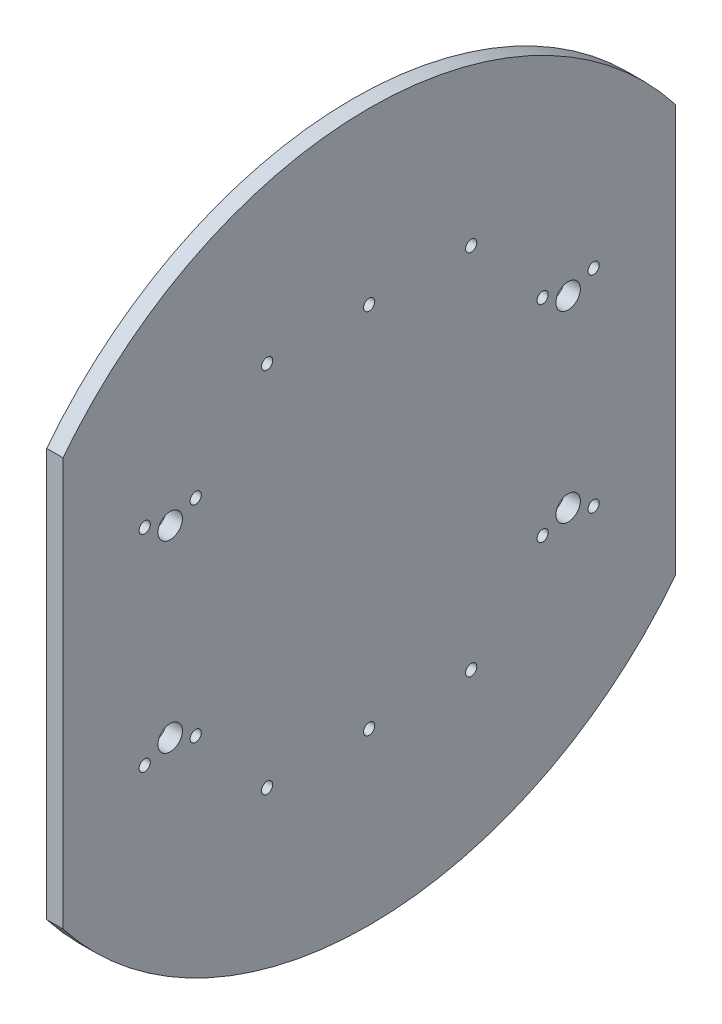
ISO-10303-21;
HEADER;
FILE_DESCRIPTION(('STEP AP214'),'2;1');
FILE_NAME('part.step','',(''),(''),'','','');
FILE_SCHEMA(('AUTOMOTIVE_DESIGN { 1 0 10303 214 1 1 1 1 }'));
ENDSEC;
DATA;
#1=APPLICATION_CONTEXT('core data for automotive mechanical design processes');
#2=APPLICATION_PROTOCOL_DEFINITION('international standard','automotive_design',2000,#1);
#3=PRODUCT_CONTEXT('',#1,'mechanical');
#4=PRODUCT('Part','Part','',(#3));
#5=PRODUCT_RELATED_PRODUCT_CATEGORY('part','',(#4));
#6=PRODUCT_DEFINITION_FORMATION('','',#4);
#7=PRODUCT_DEFINITION_CONTEXT('part definition',#1,'design');
#8=PRODUCT_DEFINITION('design','',#6,#7);
#9=PRODUCT_DEFINITION_SHAPE('','',#8);
#10=(LENGTH_UNIT() NAMED_UNIT(*) SI_UNIT(.MILLI.,.METRE.));
#11=(NAMED_UNIT(*) PLANE_ANGLE_UNIT() SI_UNIT($,.RADIAN.));
#12=(NAMED_UNIT(*) SI_UNIT($,.STERADIAN.) SOLID_ANGLE_UNIT());
#13=UNCERTAINTY_MEASURE_WITH_UNIT(LENGTH_MEASURE(1.E-05),#10,'distance_accuracy_value','');
#14=(GEOMETRIC_REPRESENTATION_CONTEXT(3) GLOBAL_UNCERTAINTY_ASSIGNED_CONTEXT((#13)) GLOBAL_UNIT_ASSIGNED_CONTEXT((#10,
#11,#12)) REPRESENTATION_CONTEXT('',''));
#15=CARTESIAN_POINT('',(0.,0.,0.));
#16=DIRECTION('',(0.,0.,1.));
#17=DIRECTION('',(1.,0.,0.));
#18=AXIS2_PLACEMENT_3D('',#15,#16,#17);
#19=CARTESIAN_POINT('',(8.,-16.619037896906,0.));
#20=DIRECTION('',(-1.,0.,0.));
#21=DIRECTION('',(0.,0.,1.));
#22=AXIS2_PLACEMENT_3D('',#19,#20,#21);
#23=CYLINDRICAL_SURFACE('',#22,190.);
#24=CARTESIAN_POINT('',(0.,-16.619037896906,0.));
#25=DIRECTION('',(1.,0.,0.));
#26=DIRECTION('',(0.,0.,-1.));
#27=AXIS2_PLACEMENT_3D('',#24,#25,#26);
#28=CIRCLE('',#27,190.);
#29=CARTESIAN_POINT('',(0.,100.,-150.));
#30=VERTEX_POINT('',#29);
#31=CARTESIAN_POINT('',(0.,100.,150.));
#32=VERTEX_POINT('',#31);
#33=EDGE_CURVE('E115',#30,#32,#28,.T.);
#34=ORIENTED_EDGE('',*,*,#33,.T.);
#35=DIRECTION('',(-1.,0.,0.));
#36=VECTOR('',#35,1.);
#37=CARTESIAN_POINT('',(8.,100.,150.));
#38=LINE('',#37,#36);
#39=CARTESIAN_POINT('',(8.,100.,150.));
#40=VERTEX_POINT('',#39);
#41=EDGE_CURVE('E11',#40,#32,#38,.T.);
#42=ORIENTED_EDGE('',*,*,#41,.F.);
#43=CARTESIAN_POINT('',(8.,-16.619037896906,0.));
#44=DIRECTION('',(1.,0.,0.));
#45=DIRECTION('',(0.,0.,-1.));
#46=AXIS2_PLACEMENT_3D('',#43,#44,#45);
#47=CIRCLE('',#46,190.);
#48=CARTESIAN_POINT('',(8.,100.,-150.));
#49=VERTEX_POINT('',#48);
#50=EDGE_CURVE('E98',#49,#40,#47,.T.);
#51=ORIENTED_EDGE('',*,*,#50,.F.);
#52=DIRECTION('',(-1.,0.,0.));
#53=VECTOR('',#52,1.);
#54=CARTESIAN_POINT('',(8.,100.,-150.));
#55=LINE('',#54,#53);
#56=EDGE_CURVE('E111',#49,#30,#55,.T.);
#57=ORIENTED_EDGE('',*,*,#56,.T.);
#58=EDGE_LOOP('',(#34,#42,#51,#57));
#59=FACE_BOUND('',#58,.T.);
#60=ADVANCED_FACE('F44',(#59),#23,.T.);
#61=CARTESIAN_POINT('',(8.,100.,150.));
#62=DIRECTION('',(0.,0.,-1.));
#63=DIRECTION('',(-1.,0.,0.));
#64=AXIS2_PLACEMENT_3D('',#61,#62,#63);
#65=PLANE('',#64);
#66=DIRECTION('',(0.,-1.,0.));
#67=VECTOR('',#66,1.);
#68=CARTESIAN_POINT('',(0.,100.,150.));
#69=LINE('',#68,#67);
#70=CARTESIAN_POINT('',(0.,-100.,150.));
#71=VERTEX_POINT('',#70);
#72=EDGE_CURVE('E103',#32,#71,#69,.T.);
#73=ORIENTED_EDGE('',*,*,#72,.T.);
#74=DIRECTION('',(-1.,0.,0.));
#75=VECTOR('',#74,1.);
#76=CARTESIAN_POINT('',(8.,-100.,150.));
#77=LINE('',#76,#75);
#78=CARTESIAN_POINT('',(8.,-100.,150.));
#79=VERTEX_POINT('',#78);
#80=EDGE_CURVE('E54',#79,#71,#77,.T.);
#81=ORIENTED_EDGE('',*,*,#80,.F.);
#82=DIRECTION('',(0.,-1.,0.));
#83=VECTOR('',#82,1.);
#84=CARTESIAN_POINT('',(8.,100.,150.));
#85=LINE('',#84,#83);
#86=EDGE_CURVE('E93',#40,#79,#85,.T.);
#87=ORIENTED_EDGE('',*,*,#86,.F.);
#88=ORIENTED_EDGE('',*,*,#41,.T.);
#89=EDGE_LOOP('',(#73,#81,#87,#88));
#90=FACE_BOUND('',#89,.T.);
#91=ADVANCED_FACE('F102',(#90),#65,.F.);
#92=CARTESIAN_POINT('',(8.,16.619037896906,0.));
#93=DIRECTION('',(-1.,0.,0.));
#94=DIRECTION('',(0.,0.,1.));
#95=AXIS2_PLACEMENT_3D('',#92,#93,#94);
#96=CYLINDRICAL_SURFACE('',#95,190.);
#97=CARTESIAN_POINT('',(0.,16.619037896906,0.));
#98=DIRECTION('',(1.,0.,0.));
#99=DIRECTION('',(0.,0.,1.));
#100=AXIS2_PLACEMENT_3D('',#97,#98,#99);
#101=CIRCLE('',#100,190.);
#102=CARTESIAN_POINT('',(0.,-99.9999999999999,-150.));
#103=VERTEX_POINT('',#102);
#104=EDGE_CURVE('E80',#71,#103,#101,.T.);
#105=ORIENTED_EDGE('',*,*,#104,.T.);
#106=DIRECTION('',(-1.,0.,0.));
#107=VECTOR('',#106,1.);
#108=CARTESIAN_POINT('',(8.,-99.9999999999999,-150.));
#109=LINE('',#108,#107);
#110=CARTESIAN_POINT('',(8.,-99.9999999999999,-150.));
#111=VERTEX_POINT('',#110);
#112=EDGE_CURVE('E105',#111,#103,#109,.T.);
#113=ORIENTED_EDGE('',*,*,#112,.F.);
#114=CARTESIAN_POINT('',(8.,16.619037896906,0.));
#115=DIRECTION('',(1.,0.,0.));
#116=DIRECTION('',(0.,0.,1.));
#117=AXIS2_PLACEMENT_3D('',#114,#115,#116);
#118=CIRCLE('',#117,190.);
#119=EDGE_CURVE('E96',#79,#111,#118,.T.);
#120=ORIENTED_EDGE('',*,*,#119,.F.);
#121=ORIENTED_EDGE('',*,*,#80,.T.);
#122=EDGE_LOOP('',(#105,#113,#120,#121));
#123=FACE_BOUND('',#122,.T.);
#124=ADVANCED_FACE('F107',(#123),#96,.T.);
#125=CARTESIAN_POINT('',(8.,100.,-150.));
#126=DIRECTION('',(0.,0.,1.));
#127=DIRECTION('',(1.,0.,0.));
#128=AXIS2_PLACEMENT_3D('',#125,#126,#127);
#129=PLANE('',#128);
#130=DIRECTION('',(0.,1.,0.));
#131=VECTOR('',#130,1.);
#132=CARTESIAN_POINT('',(0.,100.,-150.));
#133=LINE('',#132,#131);
#134=EDGE_CURVE('E86',#103,#30,#133,.T.);
#135=ORIENTED_EDGE('',*,*,#134,.T.);
#136=ORIENTED_EDGE('',*,*,#56,.F.);
#137=DIRECTION('',(0.,1.,0.));
#138=VECTOR('',#137,1.);
#139=CARTESIAN_POINT('',(8.,100.,-150.));
#140=LINE('',#139,#138);
#141=EDGE_CURVE('E63',#111,#49,#140,.T.);
#142=ORIENTED_EDGE('',*,*,#141,.F.);
#143=ORIENTED_EDGE('',*,*,#112,.T.);
#144=EDGE_LOOP('',(#135,#136,#142,#143));
#145=FACE_BOUND('',#144,.T.);
#146=ADVANCED_FACE('F260',(#145),#129,.F.);
#147=CARTESIAN_POINT('',(8.,-16.619037896906,0.));
#148=DIRECTION('',(1.,0.,0.));
#149=DIRECTION('',(0.,0.,-1.));
#150=AXIS2_PLACEMENT_3D('',#147,#148,#149);
#151=PLANE('',#150);
#152=CARTESIAN_POINT('',(8.,-90.,50.));
#153=DIRECTION('',(1.,0.,0.));
#154=DIRECTION('',(0.,0.,-1.));
#155=AXIS2_PLACEMENT_3D('',#152,#153,#154);
#156=CIRCLE('',#155,2.75000000000001);
#157=CARTESIAN_POINT('',(8.,-90.,47.25));
#158=VERTEX_POINT('',#157);
#159=EDGE_CURVE('E463',#158,#158,#156,.T.);
#160=ORIENTED_EDGE('',*,*,#159,.F.);
#161=EDGE_LOOP('',(#160));
#162=FACE_BOUND('',#161,.T.);
#163=CARTESIAN_POINT('',(8.,-90.,0.));
#164=DIRECTION('',(1.,0.,0.));
#165=DIRECTION('',(0.,0.,-1.));
#166=AXIS2_PLACEMENT_3D('',#163,#164,#165);
#167=CIRCLE('',#166,2.75);
#168=CARTESIAN_POINT('',(8.,-90.,-2.75000000000001));
#169=VERTEX_POINT('',#168);
#170=EDGE_CURVE('E465',#169,#169,#167,.T.);
#171=ORIENTED_EDGE('',*,*,#170,.F.);
#172=EDGE_LOOP('',(#171));
#173=FACE_BOUND('',#172,.T.);
#174=CARTESIAN_POINT('',(8.,-90.,-50.));
#175=DIRECTION('',(1.,0.,0.));
#176=DIRECTION('',(0.,0.,-1.));
#177=AXIS2_PLACEMENT_3D('',#174,#175,#176);
#178=CIRCLE('',#177,2.75000000000001);
#179=CARTESIAN_POINT('',(8.,-90.,-52.75));
#180=VERTEX_POINT('',#179);
#181=EDGE_CURVE('E469',#180,#180,#178,.T.);
#182=ORIENTED_EDGE('',*,*,#181,.F.);
#183=EDGE_LOOP('',(#182));
#184=FACE_BOUND('',#183,.T.);
#185=CARTESIAN_POINT('',(8.,90.,-50.));
#186=DIRECTION('',(1.,0.,0.));
#187=DIRECTION('',(0.,0.,-1.));
#188=AXIS2_PLACEMENT_3D('',#185,#186,#187);
#189=CIRCLE('',#188,2.75000000000001);
#190=CARTESIAN_POINT('',(8.,90.,-52.75));
#191=VERTEX_POINT('',#190);
#192=EDGE_CURVE('E478',#191,#191,#189,.T.);
#193=ORIENTED_EDGE('',*,*,#192,.F.);
#194=EDGE_LOOP('',(#193));
#195=FACE_BOUND('',#194,.T.);
#196=CARTESIAN_POINT('',(8.,90.,0.));
#197=DIRECTION('',(1.,0.,0.));
#198=DIRECTION('',(0.,0.,-1.));
#199=AXIS2_PLACEMENT_3D('',#196,#197,#198);
#200=CIRCLE('',#199,2.75);
#201=CARTESIAN_POINT('',(8.,90.,-2.74999999999999));
#202=VERTEX_POINT('',#201);
#203=EDGE_CURVE('E474',#202,#202,#200,.T.);
#204=ORIENTED_EDGE('',*,*,#203,.F.);
#205=EDGE_LOOP('',(#204));
#206=FACE_BOUND('',#205,.T.);
#207=CARTESIAN_POINT('',(8.,90.,50.));
#208=DIRECTION('',(1.,0.,0.));
#209=DIRECTION('',(0.,0.,-1.));
#210=AXIS2_PLACEMENT_3D('',#207,#208,#209);
#211=CIRCLE('',#210,2.75000000000001);
#212=CARTESIAN_POINT('',(8.,90.,47.25));
#213=VERTEX_POINT('',#212);
#214=EDGE_CURVE('E135',#213,#213,#211,.T.);
#215=ORIENTED_EDGE('',*,*,#214,.F.);
#216=EDGE_LOOP('',(#215));
#217=FACE_BOUND('',#216,.T.);
#218=CARTESIAN_POINT('',(8.,-50.5,-110.));
#219=DIRECTION('',(1.,0.,0.));
#220=DIRECTION('',(0.,0.,-1.));
#221=AXIS2_PLACEMENT_3D('',#218,#219,#220);
#222=CIRCLE('',#221,2.75000000000001);
#223=CARTESIAN_POINT('',(8.,-50.5,-112.75));
#224=VERTEX_POINT('',#223);
#225=EDGE_CURVE('E200',#224,#224,#222,.T.);
#226=ORIENTED_EDGE('',*,*,#225,.F.);
#227=EDGE_LOOP('',(#226));
#228=FACE_BOUND('',#227,.T.);
#229=CARTESIAN_POINT('',(8.,-50.5,110.));
#230=DIRECTION('',(1.,0.,0.));
#231=DIRECTION('',(0.,0.,1.));
#232=AXIS2_PLACEMENT_3D('',#229,#230,#231);
#233=CIRCLE('',#232,2.75000000000001);
#234=CARTESIAN_POINT('',(8.,-50.5,112.75));
#235=VERTEX_POINT('',#234);
#236=EDGE_CURVE('E209',#235,#235,#233,.T.);
#237=ORIENTED_EDGE('',*,*,#236,.F.);
#238=EDGE_LOOP('',(#237));
#239=FACE_BOUND('',#238,.T.);
#240=CARTESIAN_POINT('',(8.,-50.5,85.));
#241=DIRECTION('',(1.,0.,0.));
#242=DIRECTION('',(0.,0.,1.));
#243=AXIS2_PLACEMENT_3D('',#240,#241,#242);
#244=CIRCLE('',#243,2.75000000000001);
#245=CARTESIAN_POINT('',(8.,-50.5,87.75));
#246=VERTEX_POINT('',#245);
#247=EDGE_CURVE('E184',#246,#246,#244,.T.);
#248=ORIENTED_EDGE('',*,*,#247,.F.);
#249=EDGE_LOOP('',(#248));
#250=FACE_BOUND('',#249,.T.);
#251=CARTESIAN_POINT('',(8.,50.5,110.));
#252=DIRECTION('',(1.,0.,0.));
#253=DIRECTION('',(0.,0.,1.));
#254=AXIS2_PLACEMENT_3D('',#251,#252,#253);
#255=CIRCLE('',#254,2.75000000000001);
#256=CARTESIAN_POINT('',(8.,50.5,112.75));
#257=VERTEX_POINT('',#256);
#258=EDGE_CURVE('E193',#257,#257,#255,.T.);
#259=ORIENTED_EDGE('',*,*,#258,.F.);
#260=EDGE_LOOP('',(#259));
#261=FACE_BOUND('',#260,.T.);
#262=CARTESIAN_POINT('',(8.,-45.,-97.5));
#263=DIRECTION('',(1.,0.,0.));
#264=DIRECTION('',(0.,0.,-1.));
#265=AXIS2_PLACEMENT_3D('',#262,#263,#264);
#266=CIRCLE('',#265,6.);
#267=CARTESIAN_POINT('',(8.,-45.,-103.5));
#268=VERTEX_POINT('',#267);
#269=EDGE_CURVE('E232',#268,#268,#266,.T.);
#270=ORIENTED_EDGE('',*,*,#269,.F.);
#271=EDGE_LOOP('',(#270));
#272=FACE_BOUND('',#271,.T.);
#273=CARTESIAN_POINT('',(8.,50.5,-85.));
#274=DIRECTION('',(1.,0.,0.));
#275=DIRECTION('',(0.,0.,-1.));
#276=AXIS2_PLACEMENT_3D('',#273,#274,#275);
#277=CIRCLE('',#276,2.75000000000001);
#278=CARTESIAN_POINT('',(8.,50.5,-87.75));
#279=VERTEX_POINT('',#278);
#280=EDGE_CURVE('E241',#279,#279,#277,.T.);
#281=ORIENTED_EDGE('',*,*,#280,.F.);
#282=EDGE_LOOP('',(#281));
#283=FACE_BOUND('',#282,.T.);
#284=CARTESIAN_POINT('',(8.,50.5,-110.));
#285=DIRECTION('',(1.,0.,0.));
#286=DIRECTION('',(0.,0.,-1.));
#287=AXIS2_PLACEMENT_3D('',#284,#285,#286);
#288=CIRCLE('',#287,2.75000000000001);
#289=CARTESIAN_POINT('',(8.,50.5,-112.75));
#290=VERTEX_POINT('',#289);
#291=EDGE_CURVE('E216',#290,#290,#288,.T.);
#292=ORIENTED_EDGE('',*,*,#291,.F.);
#293=EDGE_LOOP('',(#292));
#294=FACE_BOUND('',#293,.T.);
#295=CARTESIAN_POINT('',(8.,-50.5,-85.));
#296=DIRECTION('',(1.,0.,0.));
#297=DIRECTION('',(0.,0.,-1.));
#298=AXIS2_PLACEMENT_3D('',#295,#296,#297);
#299=CIRCLE('',#298,2.75000000000001);
#300=CARTESIAN_POINT('',(8.,-50.5,-87.75));
#301=VERTEX_POINT('',#300);
#302=EDGE_CURVE('E225',#301,#301,#299,.T.);
#303=ORIENTED_EDGE('',*,*,#302,.F.);
#304=EDGE_LOOP('',(#303));
#305=FACE_BOUND('',#304,.T.);
#306=CARTESIAN_POINT('',(8.,45.,97.5000000000001));
#307=DIRECTION('',(1.,0.,0.));
#308=DIRECTION('',(0.,0.,1.));
#309=AXIS2_PLACEMENT_3D('',#306,#307,#308);
#310=CIRCLE('',#309,6.);
#311=CARTESIAN_POINT('',(8.,45.,103.5));
#312=VERTEX_POINT('',#311);
#313=EDGE_CURVE('E158',#312,#312,#310,.T.);
#314=ORIENTED_EDGE('',*,*,#313,.F.);
#315=EDGE_LOOP('',(#314));
#316=FACE_BOUND('',#315,.T.);
#317=CARTESIAN_POINT('',(8.,-45.,97.5));
#318=DIRECTION('',(1.,0.,0.));
#319=DIRECTION('',(0.,0.,1.));
#320=AXIS2_PLACEMENT_3D('',#317,#318,#319);
#321=CIRCLE('',#320,6.);
#322=CARTESIAN_POINT('',(8.,-45.,103.5));
#323=VERTEX_POINT('',#322);
#324=EDGE_CURVE('E177',#323,#323,#321,.T.);
#325=ORIENTED_EDGE('',*,*,#324,.F.);
#326=EDGE_LOOP('',(#325));
#327=FACE_BOUND('',#326,.T.);
#328=CARTESIAN_POINT('',(8.,50.5,85.));
#329=DIRECTION('',(1.,0.,0.));
#330=DIRECTION('',(0.,0.,1.));
#331=AXIS2_PLACEMENT_3D('',#328,#329,#330);
#332=CIRCLE('',#331,2.75000000000001);
#333=CARTESIAN_POINT('',(8.,50.5,87.75));
#334=VERTEX_POINT('',#333);
#335=EDGE_CURVE('E168',#334,#334,#332,.T.);
#336=ORIENTED_EDGE('',*,*,#335,.F.);
#337=EDGE_LOOP('',(#336));
#338=FACE_BOUND('',#337,.T.);
#339=CARTESIAN_POINT('',(8.,45.,-97.5));
#340=DIRECTION('',(1.,0.,0.));
#341=DIRECTION('',(0.,0.,-1.));
#342=AXIS2_PLACEMENT_3D('',#339,#340,#341);
#343=CIRCLE('',#342,6.);
#344=CARTESIAN_POINT('',(8.,45.,-103.5));
#345=VERTEX_POINT('',#344);
#346=EDGE_CURVE('E236',#345,#345,#343,.T.);
#347=ORIENTED_EDGE('',*,*,#346,.F.);
#348=EDGE_LOOP('',(#347));
#349=FACE_BOUND('',#348,.T.);
#350=ORIENTED_EDGE('',*,*,#50,.T.);
#351=ORIENTED_EDGE('',*,*,#86,.T.);
#352=ORIENTED_EDGE('',*,*,#119,.T.);
#353=ORIENTED_EDGE('',*,*,#141,.T.);
#354=EDGE_LOOP('',(#350,#351,#352,#353));
#355=FACE_BOUND('',#354,.T.);
#356=ADVANCED_FACE('F94',(#162,#173,#184,#195,#206,#217,#228,#239,#250,#261,#272,#283,#294,#305,
#316,#327,#338,#349,#355),#151,.T.);
#357=CARTESIAN_POINT('',(0.,-16.619037896906,0.));
#358=DIRECTION('',(1.,0.,0.));
#359=DIRECTION('',(0.,0.,-1.));
#360=AXIS2_PLACEMENT_3D('',#357,#358,#359);
#361=PLANE('',#360);
#362=CARTESIAN_POINT('',(0.,-90.,50.));
#363=DIRECTION('',(1.,0.,0.));
#364=DIRECTION('',(0.,0.,-1.));
#365=AXIS2_PLACEMENT_3D('',#362,#363,#364);
#366=CIRCLE('',#365,2.75000000000001);
#367=CARTESIAN_POINT('',(0.,-90.,47.25));
#368=VERTEX_POINT('',#367);
#369=EDGE_CURVE('E47',#368,#368,#366,.T.);
#370=ORIENTED_EDGE('',*,*,#369,.T.);
#371=EDGE_LOOP('',(#370));
#372=FACE_BOUND('',#371,.T.);
#373=CARTESIAN_POINT('',(0.,-90.,0.));
#374=DIRECTION('',(1.,0.,0.));
#375=DIRECTION('',(0.,0.,-1.));
#376=AXIS2_PLACEMENT_3D('',#373,#374,#375);
#377=CIRCLE('',#376,2.75);
#378=CARTESIAN_POINT('',(0.,-90.,-2.75000000000001));
#379=VERTEX_POINT('',#378);
#380=EDGE_CURVE('E146',#379,#379,#377,.T.);
#381=ORIENTED_EDGE('',*,*,#380,.T.);
#382=EDGE_LOOP('',(#381));
#383=FACE_BOUND('',#382,.T.);
#384=CARTESIAN_POINT('',(0.,-90.,-50.));
#385=DIRECTION('',(1.,0.,0.));
#386=DIRECTION('',(0.,0.,-1.));
#387=AXIS2_PLACEMENT_3D('',#384,#385,#386);
#388=CIRCLE('',#387,2.75000000000001);
#389=CARTESIAN_POINT('',(0.,-90.,-52.75));
#390=VERTEX_POINT('',#389);
#391=EDGE_CURVE('E143',#390,#390,#388,.T.);
#392=ORIENTED_EDGE('',*,*,#391,.T.);
#393=EDGE_LOOP('',(#392));
#394=FACE_BOUND('',#393,.T.);
#395=CARTESIAN_POINT('',(0.,90.,-50.));
#396=DIRECTION('',(1.,0.,0.));
#397=DIRECTION('',(0.,0.,-1.));
#398=AXIS2_PLACEMENT_3D('',#395,#396,#397);
#399=CIRCLE('',#398,2.75000000000001);
#400=CARTESIAN_POINT('',(0.,90.,-52.75));
#401=VERTEX_POINT('',#400);
#402=EDGE_CURVE('E139',#401,#401,#399,.T.);
#403=ORIENTED_EDGE('',*,*,#402,.T.);
#404=EDGE_LOOP('',(#403));
#405=FACE_BOUND('',#404,.T.);
#406=CARTESIAN_POINT('',(0.,90.,0.));
#407=DIRECTION('',(1.,0.,0.));
#408=DIRECTION('',(0.,0.,-1.));
#409=AXIS2_PLACEMENT_3D('',#406,#407,#408);
#410=CIRCLE('',#409,2.75);
#411=CARTESIAN_POINT('',(0.,90.,-2.74999999999999));
#412=VERTEX_POINT('',#411);
#413=EDGE_CURVE('E134',#412,#412,#410,.T.);
#414=ORIENTED_EDGE('',*,*,#413,.T.);
#415=EDGE_LOOP('',(#414));
#416=FACE_BOUND('',#415,.T.);
#417=CARTESIAN_POINT('',(0.,90.,50.));
#418=DIRECTION('',(1.,0.,0.));
#419=DIRECTION('',(0.,0.,-1.));
#420=AXIS2_PLACEMENT_3D('',#417,#418,#419);
#421=CIRCLE('',#420,2.75000000000001);
#422=CARTESIAN_POINT('',(0.,90.,47.25));
#423=VERTEX_POINT('',#422);
#424=EDGE_CURVE('E130',#423,#423,#421,.T.);
#425=ORIENTED_EDGE('',*,*,#424,.T.);
#426=EDGE_LOOP('',(#425));
#427=FACE_BOUND('',#426,.T.);
#428=CARTESIAN_POINT('',(0.,-50.5,-110.));
#429=DIRECTION('',(1.,0.,0.));
#430=DIRECTION('',(0.,0.,-1.));
#431=AXIS2_PLACEMENT_3D('',#428,#429,#430);
#432=CIRCLE('',#431,2.75000000000001);
#433=CARTESIAN_POINT('',(0.,-50.5,-112.75));
#434=VERTEX_POINT('',#433);
#435=EDGE_CURVE('E205',#434,#434,#432,.T.);
#436=ORIENTED_EDGE('',*,*,#435,.T.);
#437=EDGE_LOOP('',(#436));
#438=FACE_BOUND('',#437,.T.);
#439=CARTESIAN_POINT('',(0.,-50.5,110.));
#440=DIRECTION('',(1.,0.,0.));
#441=DIRECTION('',(0.,0.,1.));
#442=AXIS2_PLACEMENT_3D('',#439,#440,#441);
#443=CIRCLE('',#442,2.75000000000001);
#444=CARTESIAN_POINT('',(0.,-50.5,112.75));
#445=VERTEX_POINT('',#444);
#446=EDGE_CURVE('E188',#445,#445,#443,.T.);
#447=ORIENTED_EDGE('',*,*,#446,.T.);
#448=EDGE_LOOP('',(#447));
#449=FACE_BOUND('',#448,.T.);
#450=CARTESIAN_POINT('',(0.,-50.5,85.));
#451=DIRECTION('',(1.,0.,0.));
#452=DIRECTION('',(0.,0.,1.));
#453=AXIS2_PLACEMENT_3D('',#450,#451,#452);
#454=CIRCLE('',#453,2.75000000000001);
#455=CARTESIAN_POINT('',(0.,-50.5,87.75));
#456=VERTEX_POINT('',#455);
#457=EDGE_CURVE('E189',#456,#456,#454,.T.);
#458=ORIENTED_EDGE('',*,*,#457,.T.);
#459=EDGE_LOOP('',(#458));
#460=FACE_BOUND('',#459,.T.);
#461=CARTESIAN_POINT('',(0.,50.5,110.));
#462=DIRECTION('',(1.,0.,0.));
#463=DIRECTION('',(0.,0.,1.));
#464=AXIS2_PLACEMENT_3D('',#461,#462,#463);
#465=CIRCLE('',#464,2.75000000000001);
#466=CARTESIAN_POINT('',(0.,50.5,112.75));
#467=VERTEX_POINT('',#466);
#468=EDGE_CURVE('E172',#467,#467,#465,.T.);
#469=ORIENTED_EDGE('',*,*,#468,.T.);
#470=EDGE_LOOP('',(#469));
#471=FACE_BOUND('',#470,.T.);
#472=CARTESIAN_POINT('',(0.,-45.,-97.5));
#473=DIRECTION('',(1.,0.,0.));
#474=DIRECTION('',(0.,0.,-1.));
#475=AXIS2_PLACEMENT_3D('',#472,#473,#474);
#476=CIRCLE('',#475,6.);
#477=CARTESIAN_POINT('',(0.,-45.,-103.5));
#478=VERTEX_POINT('',#477);
#479=EDGE_CURVE('E237',#478,#478,#476,.T.);
#480=ORIENTED_EDGE('',*,*,#479,.T.);
#481=EDGE_LOOP('',(#480));
#482=FACE_BOUND('',#481,.T.);
#483=CARTESIAN_POINT('',(0.,50.5,-85.));
#484=DIRECTION('',(1.,0.,0.));
#485=DIRECTION('',(0.,0.,-1.));
#486=AXIS2_PLACEMENT_3D('',#483,#484,#485);
#487=CIRCLE('',#486,2.75000000000001);
#488=CARTESIAN_POINT('',(0.,50.5,-87.75));
#489=VERTEX_POINT('',#488);
#490=EDGE_CURVE('E220',#489,#489,#487,.T.);
#491=ORIENTED_EDGE('',*,*,#490,.T.);
#492=EDGE_LOOP('',(#491));
#493=FACE_BOUND('',#492,.T.);
#494=CARTESIAN_POINT('',(0.,50.5,-110.));
#495=DIRECTION('',(1.,0.,0.));
#496=DIRECTION('',(0.,0.,-1.));
#497=AXIS2_PLACEMENT_3D('',#494,#495,#496);
#498=CIRCLE('',#497,2.75000000000001);
#499=CARTESIAN_POINT('',(0.,50.5,-112.75));
#500=VERTEX_POINT('',#499);
#501=EDGE_CURVE('E221',#500,#500,#498,.T.);
#502=ORIENTED_EDGE('',*,*,#501,.T.);
#503=EDGE_LOOP('',(#502));
#504=FACE_BOUND('',#503,.T.);
#505=CARTESIAN_POINT('',(0.,-50.5,-85.));
#506=DIRECTION('',(1.,0.,0.));
#507=DIRECTION('',(0.,0.,-1.));
#508=AXIS2_PLACEMENT_3D('',#505,#506,#507);
#509=CIRCLE('',#508,2.75000000000001);
#510=CARTESIAN_POINT('',(0.,-50.5,-87.75));
#511=VERTEX_POINT('',#510);
#512=EDGE_CURVE('E204',#511,#511,#509,.T.);
#513=ORIENTED_EDGE('',*,*,#512,.T.);
#514=EDGE_LOOP('',(#513));
#515=FACE_BOUND('',#514,.T.);
#516=CARTESIAN_POINT('',(0.,45.,97.5000000000001));
#517=DIRECTION('',(1.,0.,0.));
#518=DIRECTION('',(0.,0.,1.));
#519=AXIS2_PLACEMENT_3D('',#516,#517,#518);
#520=CIRCLE('',#519,6.);
#521=CARTESIAN_POINT('',(0.,45.,103.5));
#522=VERTEX_POINT('',#521);
#523=EDGE_CURVE('E153',#522,#522,#520,.T.);
#524=ORIENTED_EDGE('',*,*,#523,.T.);
#525=EDGE_LOOP('',(#524));
#526=FACE_BOUND('',#525,.T.);
#527=CARTESIAN_POINT('',(0.,-45.,97.5));
#528=DIRECTION('',(1.,0.,0.));
#529=DIRECTION('',(0.,0.,1.));
#530=AXIS2_PLACEMENT_3D('',#527,#528,#529);
#531=CIRCLE('',#530,6.);
#532=CARTESIAN_POINT('',(0.,-45.,103.5));
#533=VERTEX_POINT('',#532);
#534=EDGE_CURVE('E164',#533,#533,#531,.T.);
#535=ORIENTED_EDGE('',*,*,#534,.T.);
#536=EDGE_LOOP('',(#535));
#537=FACE_BOUND('',#536,.T.);
#538=CARTESIAN_POINT('',(0.,50.5,85.));
#539=DIRECTION('',(1.,0.,0.));
#540=DIRECTION('',(0.,0.,1.));
#541=AXIS2_PLACEMENT_3D('',#538,#539,#540);
#542=CIRCLE('',#541,2.75000000000001);
#543=CARTESIAN_POINT('',(0.,50.5,87.75));
#544=VERTEX_POINT('',#543);
#545=EDGE_CURVE('E173',#544,#544,#542,.T.);
#546=ORIENTED_EDGE('',*,*,#545,.T.);
#547=EDGE_LOOP('',(#546));
#548=FACE_BOUND('',#547,.T.);
#549=CARTESIAN_POINT('',(0.,45.,-97.5));
#550=DIRECTION('',(1.,0.,0.));
#551=DIRECTION('',(0.,0.,-1.));
#552=AXIS2_PLACEMENT_3D('',#549,#550,#551);
#553=CIRCLE('',#552,6.);
#554=CARTESIAN_POINT('',(0.,45.,-103.5));
#555=VERTEX_POINT('',#554);
#556=EDGE_CURVE('E119',#555,#555,#553,.T.);
#557=ORIENTED_EDGE('',*,*,#556,.T.);
#558=EDGE_LOOP('',(#557));
#559=FACE_BOUND('',#558,.T.);
#560=ORIENTED_EDGE('',*,*,#33,.F.);
#561=ORIENTED_EDGE('',*,*,#134,.F.);
#562=ORIENTED_EDGE('',*,*,#104,.F.);
#563=ORIENTED_EDGE('',*,*,#72,.F.);
#564=EDGE_LOOP('',(#560,#561,#562,#563));
#565=FACE_BOUND('',#564,.T.);
#566=ADVANCED_FACE('F259',(#372,#383,#394,#405,#416,#427,#438,#449,#460,#471,#482,#493,#504,
#515,#526,#537,#548,#559,#565),#361,.F.);
#567=CARTESIAN_POINT('',(0.,45.,-97.5));
#568=DIRECTION('',(1.,0.,0.));
#569=DIRECTION('',(0.,0.,-1.));
#570=AXIS2_PLACEMENT_3D('',#567,#568,#569);
#571=CYLINDRICAL_SURFACE('',#570,6.);
#572=ORIENTED_EDGE('',*,*,#556,.F.);
#573=EDGE_LOOP('',(#572));
#574=FACE_BOUND('',#573,.T.);
#575=ORIENTED_EDGE('',*,*,#346,.T.);
#576=EDGE_LOOP('',(#575));
#577=FACE_BOUND('',#576,.T.);
#578=ADVANCED_FACE('F256',(#574,#577),#571,.F.);
#579=CARTESIAN_POINT('',(0.,50.5,85.));
#580=DIRECTION('',(1.,0.,0.));
#581=DIRECTION('',(0.,0.,-1.));
#582=AXIS2_PLACEMENT_3D('',#579,#580,#581);
#583=CYLINDRICAL_SURFACE('',#582,2.75000000000001);
#584=ORIENTED_EDGE('',*,*,#545,.F.);
#585=EDGE_LOOP('',(#584));
#586=FACE_BOUND('',#585,.T.);
#587=ORIENTED_EDGE('',*,*,#335,.T.);
#588=EDGE_LOOP('',(#587));
#589=FACE_BOUND('',#588,.T.);
#590=ADVANCED_FACE('F298',(#586,#589),#583,.F.);
#591=CARTESIAN_POINT('',(0.,-45.,97.5));
#592=DIRECTION('',(1.,0.,0.));
#593=DIRECTION('',(0.,0.,-1.));
#594=AXIS2_PLACEMENT_3D('',#591,#592,#593);
#595=CYLINDRICAL_SURFACE('',#594,6.);
#596=ORIENTED_EDGE('',*,*,#534,.F.);
#597=EDGE_LOOP('',(#596));
#598=FACE_BOUND('',#597,.T.);
#599=ORIENTED_EDGE('',*,*,#324,.T.);
#600=EDGE_LOOP('',(#599));
#601=FACE_BOUND('',#600,.T.);
#602=ADVANCED_FACE('F307',(#598,#601),#595,.F.);
#603=CARTESIAN_POINT('',(0.,45.,97.5000000000001));
#604=DIRECTION('',(1.,0.,0.));
#605=DIRECTION('',(0.,0.,-1.));
#606=AXIS2_PLACEMENT_3D('',#603,#604,#605);
#607=CYLINDRICAL_SURFACE('',#606,6.);
#608=ORIENTED_EDGE('',*,*,#523,.F.);
#609=EDGE_LOOP('',(#608));
#610=FACE_BOUND('',#609,.T.);
#611=ORIENTED_EDGE('',*,*,#313,.T.);
#612=EDGE_LOOP('',(#611));
#613=FACE_BOUND('',#612,.T.);
#614=ADVANCED_FACE('F316',(#610,#613),#607,.F.);
#615=CARTESIAN_POINT('',(0.,-50.5,-85.));
#616=DIRECTION('',(1.,0.,0.));
#617=DIRECTION('',(0.,0.,-1.));
#618=AXIS2_PLACEMENT_3D('',#615,#616,#617);
#619=CYLINDRICAL_SURFACE('',#618,2.75000000000001);
#620=ORIENTED_EDGE('',*,*,#512,.F.);
#621=EDGE_LOOP('',(#620));
#622=FACE_BOUND('',#621,.T.);
#623=ORIENTED_EDGE('',*,*,#302,.T.);
#624=EDGE_LOOP('',(#623));
#625=FACE_BOUND('',#624,.T.);
#626=ADVANCED_FACE('F325',(#622,#625),#619,.F.);
#627=CARTESIAN_POINT('',(0.,50.5,-110.));
#628=DIRECTION('',(1.,0.,0.));
#629=DIRECTION('',(0.,0.,-1.));
#630=AXIS2_PLACEMENT_3D('',#627,#628,#629);
#631=CYLINDRICAL_SURFACE('',#630,2.75000000000001);
#632=ORIENTED_EDGE('',*,*,#501,.F.);
#633=EDGE_LOOP('',(#632));
#634=FACE_BOUND('',#633,.T.);
#635=ORIENTED_EDGE('',*,*,#291,.T.);
#636=EDGE_LOOP('',(#635));
#637=FACE_BOUND('',#636,.T.);
#638=ADVANCED_FACE('F334',(#634,#637),#631,.F.);
#639=CARTESIAN_POINT('',(0.,50.5,-85.));
#640=DIRECTION('',(1.,0.,0.));
#641=DIRECTION('',(0.,0.,-1.));
#642=AXIS2_PLACEMENT_3D('',#639,#640,#641);
#643=CYLINDRICAL_SURFACE('',#642,2.75000000000001);
#644=ORIENTED_EDGE('',*,*,#490,.F.);
#645=EDGE_LOOP('',(#644));
#646=FACE_BOUND('',#645,.T.);
#647=ORIENTED_EDGE('',*,*,#280,.T.);
#648=EDGE_LOOP('',(#647));
#649=FACE_BOUND('',#648,.T.);
#650=ADVANCED_FACE('F343',(#646,#649),#643,.F.);
#651=CARTESIAN_POINT('',(0.,-45.,-97.5));
#652=DIRECTION('',(1.,0.,0.));
#653=DIRECTION('',(0.,0.,-1.));
#654=AXIS2_PLACEMENT_3D('',#651,#652,#653);
#655=CYLINDRICAL_SURFACE('',#654,6.);
#656=ORIENTED_EDGE('',*,*,#479,.F.);
#657=EDGE_LOOP('',(#656));
#658=FACE_BOUND('',#657,.T.);
#659=ORIENTED_EDGE('',*,*,#269,.T.);
#660=EDGE_LOOP('',(#659));
#661=FACE_BOUND('',#660,.T.);
#662=ADVANCED_FACE('F352',(#658,#661),#655,.F.);
#663=CARTESIAN_POINT('',(0.,50.5,110.));
#664=DIRECTION('',(1.,0.,0.));
#665=DIRECTION('',(0.,0.,-1.));
#666=AXIS2_PLACEMENT_3D('',#663,#664,#665);
#667=CYLINDRICAL_SURFACE('',#666,2.75000000000001);
#668=ORIENTED_EDGE('',*,*,#468,.F.);
#669=EDGE_LOOP('',(#668));
#670=FACE_BOUND('',#669,.T.);
#671=ORIENTED_EDGE('',*,*,#258,.T.);
#672=EDGE_LOOP('',(#671));
#673=FACE_BOUND('',#672,.T.);
#674=ADVANCED_FACE('F361',(#670,#673),#667,.F.);
#675=CARTESIAN_POINT('',(0.,-50.5,85.));
#676=DIRECTION('',(1.,0.,0.));
#677=DIRECTION('',(0.,0.,-1.));
#678=AXIS2_PLACEMENT_3D('',#675,#676,#677);
#679=CYLINDRICAL_SURFACE('',#678,2.75000000000001);
#680=ORIENTED_EDGE('',*,*,#457,.F.);
#681=EDGE_LOOP('',(#680));
#682=FACE_BOUND('',#681,.T.);
#683=ORIENTED_EDGE('',*,*,#247,.T.);
#684=EDGE_LOOP('',(#683));
#685=FACE_BOUND('',#684,.T.);
#686=ADVANCED_FACE('F370',(#682,#685),#679,.F.);
#687=CARTESIAN_POINT('',(0.,-50.5,110.));
#688=DIRECTION('',(1.,0.,0.));
#689=DIRECTION('',(0.,0.,-1.));
#690=AXIS2_PLACEMENT_3D('',#687,#688,#689);
#691=CYLINDRICAL_SURFACE('',#690,2.75000000000001);
#692=ORIENTED_EDGE('',*,*,#446,.F.);
#693=EDGE_LOOP('',(#692));
#694=FACE_BOUND('',#693,.T.);
#695=ORIENTED_EDGE('',*,*,#236,.T.);
#696=EDGE_LOOP('',(#695));
#697=FACE_BOUND('',#696,.T.);
#698=ADVANCED_FACE('F379',(#694,#697),#691,.F.);
#699=CARTESIAN_POINT('',(0.,-50.5,-110.));
#700=DIRECTION('',(1.,0.,0.));
#701=DIRECTION('',(0.,0.,-1.));
#702=AXIS2_PLACEMENT_3D('',#699,#700,#701);
#703=CYLINDRICAL_SURFACE('',#702,2.75000000000001);
#704=ORIENTED_EDGE('',*,*,#435,.F.);
#705=EDGE_LOOP('',(#704));
#706=FACE_BOUND('',#705,.T.);
#707=ORIENTED_EDGE('',*,*,#225,.T.);
#708=EDGE_LOOP('',(#707));
#709=FACE_BOUND('',#708,.T.);
#710=ADVANCED_FACE('F387',(#706,#709),#703,.F.);
#711=CARTESIAN_POINT('',(-2.,90.,50.));
#712=DIRECTION('',(1.,0.,0.));
#713=DIRECTION('',(0.,0.,-1.));
#714=AXIS2_PLACEMENT_3D('',#711,#712,#713);
#715=CYLINDRICAL_SURFACE('',#714,2.75000000000001);
#716=ORIENTED_EDGE('',*,*,#214,.T.);
#717=EDGE_LOOP('',(#716));
#718=FACE_BOUND('',#717,.T.);
#719=ORIENTED_EDGE('',*,*,#424,.F.);
#720=EDGE_LOOP('',(#719));
#721=FACE_BOUND('',#720,.T.);
#722=ADVANCED_FACE('F395',(#718,#721),#715,.F.);
#723=CARTESIAN_POINT('',(-2.,90.,0.));
#724=DIRECTION('',(1.,0.,0.));
#725=DIRECTION('',(0.,0.,-1.));
#726=AXIS2_PLACEMENT_3D('',#723,#724,#725);
#727=CYLINDRICAL_SURFACE('',#726,2.75);
#728=ORIENTED_EDGE('',*,*,#203,.T.);
#729=EDGE_LOOP('',(#728));
#730=FACE_BOUND('',#729,.T.);
#731=ORIENTED_EDGE('',*,*,#413,.F.);
#732=EDGE_LOOP('',(#731));
#733=FACE_BOUND('',#732,.T.);
#734=ADVANCED_FACE('F408',(#730,#733),#727,.F.);
#735=CARTESIAN_POINT('',(-2.,90.,-50.));
#736=DIRECTION('',(1.,0.,0.));
#737=DIRECTION('',(0.,0.,-1.));
#738=AXIS2_PLACEMENT_3D('',#735,#736,#737);
#739=CYLINDRICAL_SURFACE('',#738,2.75000000000001);
#740=ORIENTED_EDGE('',*,*,#192,.T.);
#741=EDGE_LOOP('',(#740));
#742=FACE_BOUND('',#741,.T.);
#743=ORIENTED_EDGE('',*,*,#402,.F.);
#744=EDGE_LOOP('',(#743));
#745=FACE_BOUND('',#744,.T.);
#746=ADVANCED_FACE('F418',(#742,#745),#739,.F.);
#747=CARTESIAN_POINT('',(-2.,-90.,-50.));
#748=DIRECTION('',(1.,0.,0.));
#749=DIRECTION('',(0.,0.,-1.));
#750=AXIS2_PLACEMENT_3D('',#747,#748,#749);
#751=CYLINDRICAL_SURFACE('',#750,2.75000000000001);
#752=ORIENTED_EDGE('',*,*,#181,.T.);
#753=EDGE_LOOP('',(#752));
#754=FACE_BOUND('',#753,.T.);
#755=ORIENTED_EDGE('',*,*,#391,.F.);
#756=EDGE_LOOP('',(#755));
#757=FACE_BOUND('',#756,.T.);
#758=ADVANCED_FACE('F428',(#754,#757),#751,.F.);
#759=CARTESIAN_POINT('',(-2.,-90.,0.));
#760=DIRECTION('',(1.,0.,0.));
#761=DIRECTION('',(0.,0.,-1.));
#762=AXIS2_PLACEMENT_3D('',#759,#760,#761);
#763=CYLINDRICAL_SURFACE('',#762,2.75);
#764=ORIENTED_EDGE('',*,*,#170,.T.);
#765=EDGE_LOOP('',(#764));
#766=FACE_BOUND('',#765,.T.);
#767=ORIENTED_EDGE('',*,*,#380,.F.);
#768=EDGE_LOOP('',(#767));
#769=FACE_BOUND('',#768,.T.);
#770=ADVANCED_FACE('F438',(#766,#769),#763,.F.);
#771=CARTESIAN_POINT('',(-2.,-90.,50.));
#772=DIRECTION('',(1.,0.,0.));
#773=DIRECTION('',(0.,0.,-1.));
#774=AXIS2_PLACEMENT_3D('',#771,#772,#773);
#775=CYLINDRICAL_SURFACE('',#774,2.75000000000001);
#776=ORIENTED_EDGE('',*,*,#159,.T.);
#777=EDGE_LOOP('',(#776));
#778=FACE_BOUND('',#777,.T.);
#779=ORIENTED_EDGE('',*,*,#369,.F.);
#780=EDGE_LOOP('',(#779));
#781=FACE_BOUND('',#780,.T.);
#782=ADVANCED_FACE('F448',(#778,#781),#775,.F.);
#783=CLOSED_SHELL('',(#60,#91,#124,#146,#356,#566,#578,#590,#602,#614,#626,#638,#650,#662,#674,
#686,#698,#710,#722,#734,#746,#758,#770,#782));
#784=MANIFOLD_SOLID_BREP('B2',#783);
#785=ADVANCED_BREP_SHAPE_REPRESENTATION('',(#18,#784),#14);
#786=SHAPE_DEFINITION_REPRESENTATION(#9,#785);
ENDSEC;
END-ISO-10303-21;
